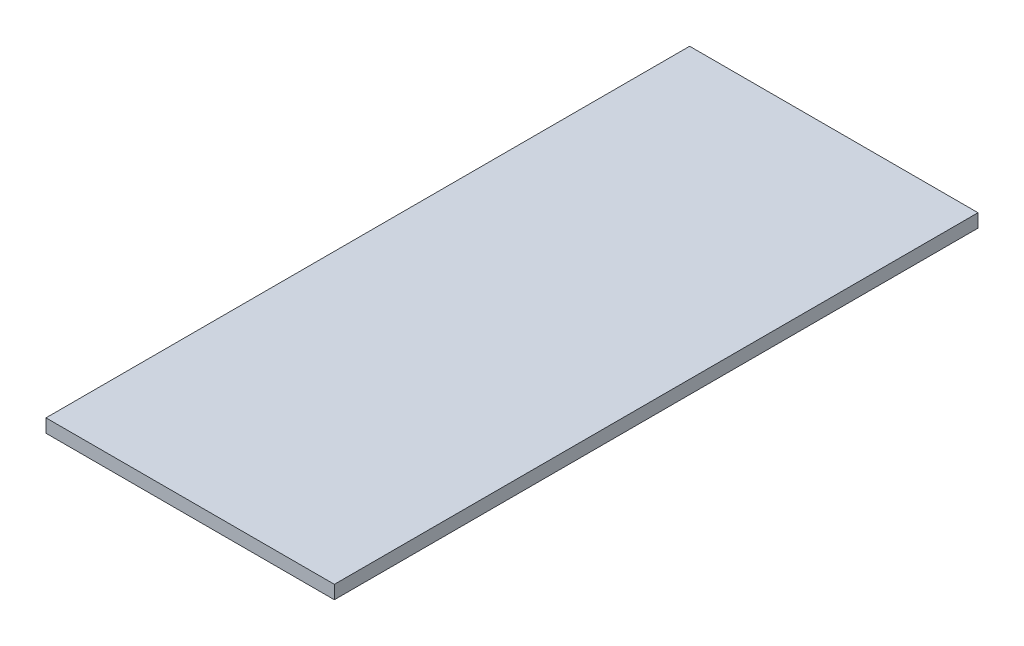
ISO-10303-21;
HEADER;
FILE_DESCRIPTION(('STEP AP214'),'2;1');
FILE_NAME('part.step','',(''),(''),'','','');
FILE_SCHEMA(('AUTOMOTIVE_DESIGN { 1 0 10303 214 1 1 1 1 }'));
ENDSEC;
DATA;
#1=APPLICATION_CONTEXT('core data for automotive mechanical design processes');
#2=APPLICATION_PROTOCOL_DEFINITION('international standard','automotive_design',2000,#1);
#3=PRODUCT_CONTEXT('',#1,'mechanical');
#4=PRODUCT('Part','Part','',(#3));
#5=PRODUCT_RELATED_PRODUCT_CATEGORY('part','',(#4));
#6=PRODUCT_DEFINITION_FORMATION('','',#4);
#7=PRODUCT_DEFINITION_CONTEXT('part definition',#1,'design');
#8=PRODUCT_DEFINITION('design','',#6,#7);
#9=PRODUCT_DEFINITION_SHAPE('','',#8);
#10=(LENGTH_UNIT() NAMED_UNIT(*) SI_UNIT(.MILLI.,.METRE.));
#11=(NAMED_UNIT(*) PLANE_ANGLE_UNIT() SI_UNIT($,.RADIAN.));
#12=(NAMED_UNIT(*) SI_UNIT($,.STERADIAN.) SOLID_ANGLE_UNIT());
#13=UNCERTAINTY_MEASURE_WITH_UNIT(LENGTH_MEASURE(1.E-05),#10,'distance_accuracy_value','');
#14=(GEOMETRIC_REPRESENTATION_CONTEXT(3) GLOBAL_UNCERTAINTY_ASSIGNED_CONTEXT((#13)) GLOBAL_UNIT_ASSIGNED_CONTEXT((#10,
#11,#12)) REPRESENTATION_CONTEXT('',''));
#15=CARTESIAN_POINT('',(0.,0.,0.));
#16=DIRECTION('',(0.,0.,1.));
#17=DIRECTION('',(1.,0.,0.));
#18=AXIS2_PLACEMENT_3D('',#15,#16,#17);
#19=CARTESIAN_POINT('',(86.2,4.,-192.4));
#20=DIRECTION('',(-1.,0.,0.));
#21=DIRECTION('',(0.,0.,1.));
#22=AXIS2_PLACEMENT_3D('',#19,#20,#21);
#23=PLANE('',#22);
#24=DIRECTION('',(0.,0.,-1.));
#25=VECTOR('',#24,1.);
#26=CARTESIAN_POINT('',(86.2,-4.,-192.4));
#27=LINE('',#26,#25);
#28=CARTESIAN_POINT('',(86.2000000000001,-4.,192.4));
#29=VERTEX_POINT('',#28);
#30=CARTESIAN_POINT('',(86.2,-4.,-192.4));
#31=VERTEX_POINT('',#30);
#32=EDGE_CURVE('E106',#29,#31,#27,.T.);
#33=ORIENTED_EDGE('',*,*,#32,.T.);
#34=DIRECTION('',(0.,-1.,0.));
#35=VECTOR('',#34,1.);
#36=CARTESIAN_POINT('',(86.2,4.,-192.4));
#37=LINE('',#36,#35);
#38=CARTESIAN_POINT('',(86.2,4.,-192.4));
#39=VERTEX_POINT('',#38);
#40=EDGE_CURVE('E11',#39,#31,#37,.T.);
#41=ORIENTED_EDGE('',*,*,#40,.F.);
#42=DIRECTION('',(0.,0.,-1.));
#43=VECTOR('',#42,1.);
#44=CARTESIAN_POINT('',(86.2,4.,-192.4));
#45=LINE('',#44,#43);
#46=CARTESIAN_POINT('',(86.2000000000001,4.,192.4));
#47=VERTEX_POINT('',#46);
#48=EDGE_CURVE('E94',#47,#39,#45,.T.);
#49=ORIENTED_EDGE('',*,*,#48,.F.);
#50=DIRECTION('',(0.,-1.,0.));
#51=VECTOR('',#50,1.);
#52=CARTESIAN_POINT('',(86.2000000000001,4.,192.4));
#53=LINE('',#52,#51);
#54=EDGE_CURVE('E102',#47,#29,#53,.T.);
#55=ORIENTED_EDGE('',*,*,#54,.T.);
#56=EDGE_LOOP('',(#33,#41,#49,#55));
#57=FACE_BOUND('',#56,.T.);
#58=ADVANCED_FACE('F43',(#57),#23,.F.);
#59=CARTESIAN_POINT('',(-86.2,4.,-192.4));
#60=DIRECTION('',(0.,0.,1.));
#61=DIRECTION('',(1.,0.,0.));
#62=AXIS2_PLACEMENT_3D('',#59,#60,#61);
#63=PLANE('',#62);
#64=DIRECTION('',(-1.,0.,0.));
#65=VECTOR('',#64,1.);
#66=CARTESIAN_POINT('',(-86.2,-4.,-192.4));
#67=LINE('',#66,#65);
#68=CARTESIAN_POINT('',(-86.2,-4.,-192.4));
#69=VERTEX_POINT('',#68);
#70=EDGE_CURVE('E98',#31,#69,#67,.T.);
#71=ORIENTED_EDGE('',*,*,#70,.T.);
#72=DIRECTION('',(0.,-1.,0.));
#73=VECTOR('',#72,1.);
#74=CARTESIAN_POINT('',(-86.2,4.,-192.4));
#75=LINE('',#74,#73);
#76=CARTESIAN_POINT('',(-86.2,4.,-192.4));
#77=VERTEX_POINT('',#76);
#78=EDGE_CURVE('E51',#77,#69,#75,.T.);
#79=ORIENTED_EDGE('',*,*,#78,.F.);
#80=DIRECTION('',(-1.,0.,0.));
#81=VECTOR('',#80,1.);
#82=CARTESIAN_POINT('',(-86.2,4.,-192.4));
#83=LINE('',#82,#81);
#84=EDGE_CURVE('E89',#39,#77,#83,.T.);
#85=ORIENTED_EDGE('',*,*,#84,.F.);
#86=ORIENTED_EDGE('',*,*,#40,.T.);
#87=EDGE_LOOP('',(#71,#79,#85,#86));
#88=FACE_BOUND('',#87,.T.);
#89=ADVANCED_FACE('F97',(#88),#63,.F.);
#90=CARTESIAN_POINT('',(-86.2,4.,-192.4));
#91=DIRECTION('',(1.,0.,0.));
#92=DIRECTION('',(0.,0.,-1.));
#93=AXIS2_PLACEMENT_3D('',#90,#91,#92);
#94=PLANE('',#93);
#95=DIRECTION('',(0.,0.,1.));
#96=VECTOR('',#95,1.);
#97=CARTESIAN_POINT('',(-86.2,-4.,-192.4));
#98=LINE('',#97,#96);
#99=CARTESIAN_POINT('',(-86.1999999999999,-4.,192.4));
#100=VERTEX_POINT('',#99);
#101=EDGE_CURVE('E76',#69,#100,#98,.T.);
#102=ORIENTED_EDGE('',*,*,#101,.T.);
#103=DIRECTION('',(0.,-1.,0.));
#104=VECTOR('',#103,1.);
#105=CARTESIAN_POINT('',(-86.1999999999999,4.,192.4));
#106=LINE('',#105,#104);
#107=CARTESIAN_POINT('',(-86.1999999999999,4.,192.4));
#108=VERTEX_POINT('',#107);
#109=EDGE_CURVE('E99',#108,#100,#106,.T.);
#110=ORIENTED_EDGE('',*,*,#109,.F.);
#111=DIRECTION('',(0.,0.,1.));
#112=VECTOR('',#111,1.);
#113=CARTESIAN_POINT('',(-86.2,4.,-192.4));
#114=LINE('',#113,#112);
#115=EDGE_CURVE('E92',#77,#108,#114,.T.);
#116=ORIENTED_EDGE('',*,*,#115,.F.);
#117=ORIENTED_EDGE('',*,*,#78,.T.);
#118=EDGE_LOOP('',(#102,#110,#116,#117));
#119=FACE_BOUND('',#118,.T.);
#120=ADVANCED_FACE('F100',(#119),#94,.F.);
#121=CARTESIAN_POINT('',(-86.1999999999999,4.,192.4));
#122=DIRECTION('',(0.,0.,-1.));
#123=DIRECTION('',(-1.,0.,0.));
#124=AXIS2_PLACEMENT_3D('',#121,#122,#123);
#125=PLANE('',#124);
#126=DIRECTION('',(1.,0.,0.));
#127=VECTOR('',#126,1.);
#128=CARTESIAN_POINT('',(-86.1999999999999,-4.,192.4));
#129=LINE('',#128,#127);
#130=EDGE_CURVE('E82',#100,#29,#129,.T.);
#131=ORIENTED_EDGE('',*,*,#130,.T.);
#132=ORIENTED_EDGE('',*,*,#54,.F.);
#133=DIRECTION('',(1.,0.,0.));
#134=VECTOR('',#133,1.);
#135=CARTESIAN_POINT('',(-86.1999999999999,4.,192.4));
#136=LINE('',#135,#134);
#137=EDGE_CURVE('E59',#108,#47,#136,.T.);
#138=ORIENTED_EDGE('',*,*,#137,.F.);
#139=ORIENTED_EDGE('',*,*,#109,.T.);
#140=EDGE_LOOP('',(#131,#132,#138,#139));
#141=FACE_BOUND('',#140,.T.);
#142=ADVANCED_FACE('F113',(#141),#125,.F.);
#143=CARTESIAN_POINT('',(0.,4.,0.));
#144=DIRECTION('',(0.,1.,0.));
#145=DIRECTION('',(0.,0.,1.));
#146=AXIS2_PLACEMENT_3D('',#143,#144,#145);
#147=PLANE('',#146);
#148=ORIENTED_EDGE('',*,*,#48,.T.);
#149=ORIENTED_EDGE('',*,*,#84,.T.);
#150=ORIENTED_EDGE('',*,*,#115,.T.);
#151=ORIENTED_EDGE('',*,*,#137,.T.);
#152=EDGE_LOOP('',(#148,#149,#150,#151));
#153=FACE_BOUND('',#152,.T.);
#154=ADVANCED_FACE('F90',(#153),#147,.T.);
#155=CARTESIAN_POINT('',(0.,-4.,0.));
#156=DIRECTION('',(0.,1.,0.));
#157=DIRECTION('',(0.,0.,1.));
#158=AXIS2_PLACEMENT_3D('',#155,#156,#157);
#159=PLANE('',#158);
#160=ORIENTED_EDGE('',*,*,#32,.F.);
#161=ORIENTED_EDGE('',*,*,#130,.F.);
#162=ORIENTED_EDGE('',*,*,#101,.F.);
#163=ORIENTED_EDGE('',*,*,#70,.F.);
#164=EDGE_LOOP('',(#160,#161,#162,#163));
#165=FACE_BOUND('',#164,.T.);
#166=ADVANCED_FACE('F116',(#165),#159,.F.);
#167=CLOSED_SHELL('',(#58,#89,#120,#142,#154,#166));
#168=MANIFOLD_SOLID_BREP('B2',#167);
#169=ADVANCED_BREP_SHAPE_REPRESENTATION('',(#18,#168),#14);
#170=SHAPE_DEFINITION_REPRESENTATION(#9,#169);
ENDSEC;
END-ISO-10303-21;
